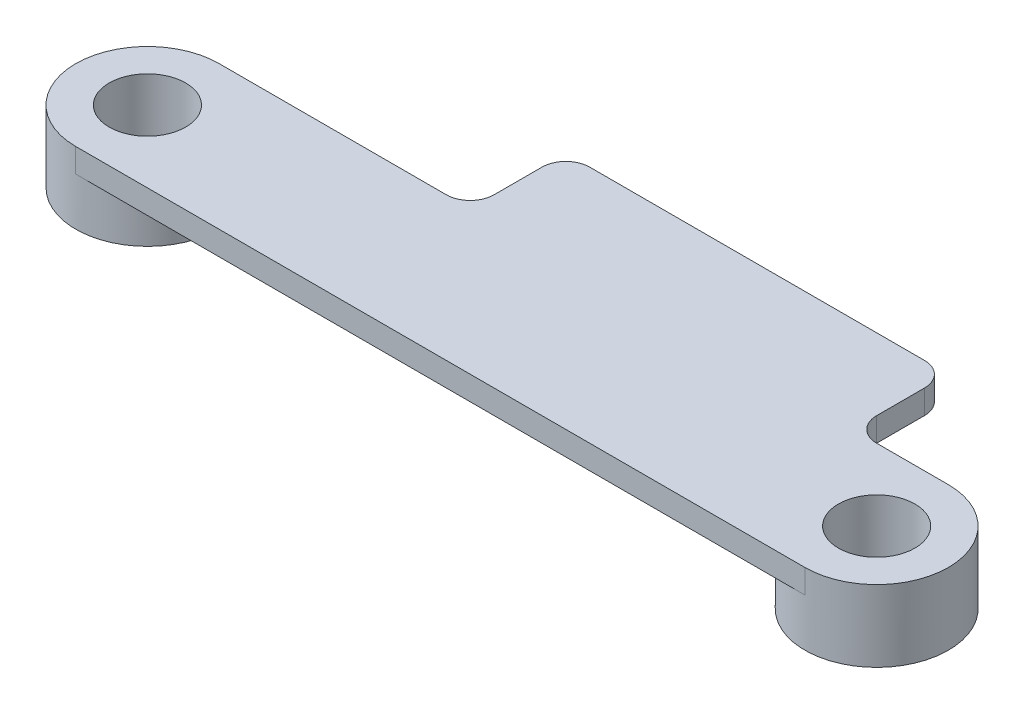
ISO-10303-21;
HEADER;
FILE_DESCRIPTION(('STEP AP214'),'2;1');
FILE_NAME('part.step','',(''),(''),'','','');
FILE_SCHEMA(('AUTOMOTIVE_DESIGN { 1 0 10303 214 1 1 1 1 }'));
ENDSEC;
DATA;
#1=APPLICATION_CONTEXT('core data for automotive mechanical design processes');
#2=APPLICATION_PROTOCOL_DEFINITION('international standard','automotive_design',2000,#1);
#3=PRODUCT_CONTEXT('',#1,'mechanical');
#4=PRODUCT('Part','Part','',(#3));
#5=PRODUCT_RELATED_PRODUCT_CATEGORY('part','',(#4));
#6=PRODUCT_DEFINITION_FORMATION('','',#4);
#7=PRODUCT_DEFINITION_CONTEXT('part definition',#1,'design');
#8=PRODUCT_DEFINITION('design','',#6,#7);
#9=PRODUCT_DEFINITION_SHAPE('','',#8);
#10=(LENGTH_UNIT() NAMED_UNIT(*) SI_UNIT(.MILLI.,.METRE.));
#11=(NAMED_UNIT(*) PLANE_ANGLE_UNIT() SI_UNIT($,.RADIAN.));
#12=(NAMED_UNIT(*) SI_UNIT($,.STERADIAN.) SOLID_ANGLE_UNIT());
#13=UNCERTAINTY_MEASURE_WITH_UNIT(LENGTH_MEASURE(1.E-05),#10,'distance_accuracy_value','');
#14=(GEOMETRIC_REPRESENTATION_CONTEXT(3) GLOBAL_UNCERTAINTY_ASSIGNED_CONTEXT((#13)) GLOBAL_UNIT_ASSIGNED_CONTEXT((#10,
#11,#12)) REPRESENTATION_CONTEXT('',''));
#15=CARTESIAN_POINT('',(0.,0.,0.));
#16=DIRECTION('',(0.,0.,1.));
#17=DIRECTION('',(1.,0.,0.));
#18=AXIS2_PLACEMENT_3D('',#15,#16,#17);
#19=CARTESIAN_POINT('',(0.,0.,0.));
#20=DIRECTION('',(0.,1.,0.));
#21=DIRECTION('',(0.,0.,1.));
#22=AXIS2_PLACEMENT_3D('',#19,#20,#21);
#23=PLANE('',#22);
#24=CARTESIAN_POINT('',(15.25,0.,0.));
#25=DIRECTION('',(0.,-1.,0.));
#26=DIRECTION('',(0.,0.,-1.));
#27=AXIS2_PLACEMENT_3D('',#24,#25,#26);
#28=CIRCLE('',#27,3.);
#29=CARTESIAN_POINT('',(15.25,0.,3.));
#30=VERTEX_POINT('',#29);
#31=CARTESIAN_POINT('',(15.25,0.,-3.));
#32=VERTEX_POINT('',#31);
#33=EDGE_CURVE('E122',#30,#32,#28,.T.);
#34=ORIENTED_EDGE('',*,*,#33,.F.);
#35=DIRECTION('',(1.,0.,0.));
#36=VECTOR('',#35,1.);
#37=CARTESIAN_POINT('',(0.,0.,3.));
#38=LINE('',#37,#36);
#39=CARTESIAN_POINT('',(-15.25,0.,3.));
#40=VERTEX_POINT('',#39);
#41=EDGE_CURVE('E125',#40,#30,#38,.T.);
#42=ORIENTED_EDGE('',*,*,#41,.F.);
#43=CARTESIAN_POINT('',(-15.25,0.,0.));
#44=DIRECTION('',(0.,-1.,0.));
#45=DIRECTION('',(0.,0.,-1.));
#46=AXIS2_PLACEMENT_3D('',#43,#44,#45);
#47=CIRCLE('',#46,3.);
#48=CARTESIAN_POINT('',(-15.25,0.,-3.));
#49=VERTEX_POINT('',#48);
#50=EDGE_CURVE('E155',#49,#40,#47,.T.);
#51=ORIENTED_EDGE('',*,*,#50,.F.);
#52=DIRECTION('',(1.,0.,0.));
#53=VECTOR('',#52,1.);
#54=CARTESIAN_POINT('',(0.,0.,-3.));
#55=LINE('',#54,#53);
#56=CARTESIAN_POINT('',(-5.75000000000001,0.,-3.));
#57=VERTEX_POINT('',#56);
#58=EDGE_CURVE('E169',#49,#57,#55,.T.);
#59=ORIENTED_EDGE('',*,*,#58,.T.);
#60=CARTESIAN_POINT('',(-5.75000000000001,0.,-4.));
#61=DIRECTION('',(0.,1.,0.));
#62=DIRECTION('',(0.,0.,1.));
#63=AXIS2_PLACEMENT_3D('',#60,#61,#62);
#64=CIRCLE('',#63,1.);
#65=CARTESIAN_POINT('',(-4.75000000000001,0.,-4.));
#66=VERTEX_POINT('',#65);
#67=EDGE_CURVE('E41',#57,#66,#64,.T.);
#68=ORIENTED_EDGE('',*,*,#67,.T.);
#69=DIRECTION('',(0.,0.,-1.));
#70=VECTOR('',#69,1.);
#71=CARTESIAN_POINT('',(-4.75000000000001,0.,0.));
#72=LINE('',#71,#70);
#73=CARTESIAN_POINT('',(-4.75000000000001,0.,-6.));
#74=VERTEX_POINT('',#73);
#75=EDGE_CURVE('E166',#66,#74,#72,.T.);
#76=ORIENTED_EDGE('',*,*,#75,.T.);
#77=CARTESIAN_POINT('',(-3.75,0.,-6.));
#78=DIRECTION('',(0.,1.,0.));
#79=DIRECTION('',(0.,0.,1.));
#80=AXIS2_PLACEMENT_3D('',#77,#78,#79);
#81=CIRCLE('',#80,1.);
#82=CARTESIAN_POINT('',(-3.75,0.,-7.));
#83=VERTEX_POINT('',#82);
#84=EDGE_CURVE('E189',#74,#83,#81,.F.);
#85=ORIENTED_EDGE('',*,*,#84,.T.);
#86=DIRECTION('',(1.,0.,0.));
#87=VECTOR('',#86,1.);
#88=CARTESIAN_POINT('',(0.,0.,-7.));
#89=LINE('',#88,#87);
#90=CARTESIAN_POINT('',(10.25,0.,-7.));
#91=VERTEX_POINT('',#90);
#92=EDGE_CURVE('E163',#83,#91,#89,.T.);
#93=ORIENTED_EDGE('',*,*,#92,.T.);
#94=CARTESIAN_POINT('',(10.25,0.,-6.));
#95=DIRECTION('',(0.,1.,0.));
#96=DIRECTION('',(0.,0.,1.));
#97=AXIS2_PLACEMENT_3D('',#94,#95,#96);
#98=CIRCLE('',#97,1.);
#99=CARTESIAN_POINT('',(11.25,0.,-6.));
#100=VERTEX_POINT('',#99);
#101=EDGE_CURVE('E191',#91,#100,#98,.F.);
#102=ORIENTED_EDGE('',*,*,#101,.T.);
#103=DIRECTION('',(0.,0.,-1.));
#104=VECTOR('',#103,1.);
#105=CARTESIAN_POINT('',(11.25,0.,0.));
#106=LINE('',#105,#104);
#107=CARTESIAN_POINT('',(11.25,0.,-4.));
#108=VERTEX_POINT('',#107);
#109=EDGE_CURVE('E152',#108,#100,#106,.T.);
#110=ORIENTED_EDGE('',*,*,#109,.F.);
#111=CARTESIAN_POINT('',(12.25,0.,-4.));
#112=DIRECTION('',(0.,1.,0.));
#113=DIRECTION('',(0.,0.,1.));
#114=AXIS2_PLACEMENT_3D('',#111,#112,#113);
#115=CIRCLE('',#114,1.);
#116=CARTESIAN_POINT('',(12.25,0.,-3.));
#117=VERTEX_POINT('',#116);
#118=EDGE_CURVE('E204',#108,#117,#115,.T.);
#119=ORIENTED_EDGE('',*,*,#118,.T.);
#120=DIRECTION('',(1.,0.,0.));
#121=VECTOR('',#120,1.);
#122=CARTESIAN_POINT('',(0.,0.,-3.));
#123=LINE('',#122,#121);
#124=EDGE_CURVE('E127',#117,#32,#123,.T.);
#125=ORIENTED_EDGE('',*,*,#124,.T.);
#126=EDGE_LOOP('',(#34,#42,#51,#59,#68,#76,#85,#93,#102,#110,#119,#125));
#127=FACE_BOUND('',#126,.T.);
#128=ADVANCED_FACE('F33',(#127),#23,.F.);
#129=CARTESIAN_POINT('',(0.,1.,3.));
#130=DIRECTION('',(0.,0.,-1.));
#131=DIRECTION('',(-1.,0.,0.));
#132=AXIS2_PLACEMENT_3D('',#129,#130,#131);
#133=PLANE('',#132);
#134=ORIENTED_EDGE('',*,*,#41,.T.);
#135=DIRECTION('',(0.,-1.,0.));
#136=VECTOR('',#135,1.);
#137=CARTESIAN_POINT('',(15.25,1.,3.));
#138=LINE('',#137,#136);
#139=CARTESIAN_POINT('',(15.25,1.,3.));
#140=VERTEX_POINT('',#139);
#141=EDGE_CURVE('E135',#140,#30,#138,.T.);
#142=ORIENTED_EDGE('',*,*,#141,.F.);
#143=DIRECTION('',(1.,0.,0.));
#144=VECTOR('',#143,1.);
#145=CARTESIAN_POINT('',(0.,1.,3.));
#146=LINE('',#145,#144);
#147=CARTESIAN_POINT('',(-15.25,1.,3.));
#148=VERTEX_POINT('',#147);
#149=EDGE_CURVE('E172',#148,#140,#146,.T.);
#150=ORIENTED_EDGE('',*,*,#149,.F.);
#151=DIRECTION('',(0.,-1.,0.));
#152=VECTOR('',#151,1.);
#153=CARTESIAN_POINT('',(-15.25,1.,3.));
#154=LINE('',#153,#152);
#155=EDGE_CURVE('E149',#148,#40,#154,.T.);
#156=ORIENTED_EDGE('',*,*,#155,.T.);
#157=EDGE_LOOP('',(#134,#142,#150,#156));
#158=FACE_BOUND('',#157,.T.);
#159=ADVANCED_FACE('F147',(#158),#133,.F.);
#160=CARTESIAN_POINT('',(15.25,1.,0.));
#161=DIRECTION('',(0.,-1.,0.));
#162=DIRECTION('',(0.,0.,-1.));
#163=AXIS2_PLACEMENT_3D('',#160,#161,#162);
#164=CYLINDRICAL_SURFACE('',#163,3.);
#165=ORIENTED_EDGE('',*,*,#141,.T.);
#166=ORIENTED_EDGE('',*,*,#33,.T.);
#167=DIRECTION('',(0.,-1.,0.));
#168=VECTOR('',#167,1.);
#169=CARTESIAN_POINT('',(15.25,1.,-3.));
#170=LINE('',#169,#168);
#171=CARTESIAN_POINT('',(15.25,1.,-3.));
#172=VERTEX_POINT('',#171);
#173=EDGE_CURVE('E144',#172,#32,#170,.T.);
#174=ORIENTED_EDGE('',*,*,#173,.F.);
#175=CARTESIAN_POINT('',(15.25,1.,0.));
#176=DIRECTION('',(0.,1.,0.));
#177=DIRECTION('',(0.,0.,1.));
#178=AXIS2_PLACEMENT_3D('',#175,#176,#177);
#179=CIRCLE('',#178,3.);
#180=EDGE_CURVE('E139',#140,#172,#179,.T.);
#181=ORIENTED_EDGE('',*,*,#180,.F.);
#182=EDGE_LOOP('',(#165,#166,#174,#181));
#183=FACE_BOUND('',#182,.T.);
#184=CARTESIAN_POINT('',(15.25,-2.,0.));
#185=DIRECTION('',(0.,-1.,0.));
#186=DIRECTION('',(0.,0.,-1.));
#187=AXIS2_PLACEMENT_3D('',#184,#185,#186);
#188=CIRCLE('',#187,3.);
#189=CARTESIAN_POINT('',(15.25,-2.,-3.));
#190=VERTEX_POINT('',#189);
#191=EDGE_CURVE('E131',#190,#190,#188,.T.);
#192=ORIENTED_EDGE('',*,*,#191,.F.);
#193=EDGE_LOOP('',(#192));
#194=FACE_BOUND('',#193,.T.);
#195=ADVANCED_FACE('F136',(#183,#194),#164,.T.);
#196=CARTESIAN_POINT('',(0.,1.,-3.));
#197=DIRECTION('',(0.,0.,-1.));
#198=DIRECTION('',(-1.,0.,0.));
#199=AXIS2_PLACEMENT_3D('',#196,#197,#198);
#200=PLANE('',#199);
#201=ORIENTED_EDGE('',*,*,#124,.F.);
#202=DIRECTION('',(0.,-1.,0.));
#203=VECTOR('',#202,1.);
#204=CARTESIAN_POINT('',(12.25,1.,-3.));
#205=LINE('',#204,#203);
#206=CARTESIAN_POINT('',(12.25,1.,-3.));
#207=VERTEX_POINT('',#206);
#208=EDGE_CURVE('E182',#117,#207,#205,.F.);
#209=ORIENTED_EDGE('',*,*,#208,.T.);
#210=DIRECTION('',(1.,0.,0.));
#211=VECTOR('',#210,1.);
#212=CARTESIAN_POINT('',(0.,1.,-3.));
#213=LINE('',#212,#211);
#214=EDGE_CURVE('E305',#207,#172,#213,.T.);
#215=ORIENTED_EDGE('',*,*,#214,.T.);
#216=ORIENTED_EDGE('',*,*,#173,.T.);
#217=EDGE_LOOP('',(#201,#209,#215,#216));
#218=FACE_BOUND('',#217,.T.);
#219=ADVANCED_FACE('F276',(#218),#200,.T.);
#220=CARTESIAN_POINT('',(11.25,1.,0.));
#221=DIRECTION('',(-1.,0.,0.));
#222=DIRECTION('',(0.,0.,1.));
#223=AXIS2_PLACEMENT_3D('',#220,#221,#222);
#224=PLANE('',#223);
#225=DIRECTION('',(0.,0.,-1.));
#226=VECTOR('',#225,1.);
#227=CARTESIAN_POINT('',(11.25,1.,0.));
#228=LINE('',#227,#226);
#229=CARTESIAN_POINT('',(11.25,1.,-4.));
#230=VERTEX_POINT('',#229);
#231=CARTESIAN_POINT('',(11.25,1.,-6.));
#232=VERTEX_POINT('',#231);
#233=EDGE_CURVE('E301',#230,#232,#228,.T.);
#234=ORIENTED_EDGE('',*,*,#233,.F.);
#235=DIRECTION('',(0.,-1.,0.));
#236=VECTOR('',#235,1.);
#237=CARTESIAN_POINT('',(11.25,1.,-4.));
#238=LINE('',#237,#236);
#239=EDGE_CURVE('E179',#230,#108,#238,.T.);
#240=ORIENTED_EDGE('',*,*,#239,.T.);
#241=ORIENTED_EDGE('',*,*,#109,.T.);
#242=DIRECTION('',(0.,-1.,0.));
#243=VECTOR('',#242,1.);
#244=CARTESIAN_POINT('',(11.25,1.,-6.));
#245=LINE('',#244,#243);
#246=EDGE_CURVE('E143',#100,#232,#245,.F.);
#247=ORIENTED_EDGE('',*,*,#246,.T.);
#248=EDGE_LOOP('',(#234,#240,#241,#247));
#249=FACE_BOUND('',#248,.T.);
#250=ADVANCED_FACE('F272',(#249),#224,.F.);
#251=CARTESIAN_POINT('',(0.,1.,-7.));
#252=DIRECTION('',(0.,0.,-1.));
#253=DIRECTION('',(-1.,0.,0.));
#254=AXIS2_PLACEMENT_3D('',#251,#252,#253);
#255=PLANE('',#254);
#256=DIRECTION('',(1.,0.,0.));
#257=VECTOR('',#256,1.);
#258=CARTESIAN_POINT('',(0.,1.,-7.));
#259=LINE('',#258,#257);
#260=CARTESIAN_POINT('',(-3.75,1.,-7.));
#261=VERTEX_POINT('',#260);
#262=CARTESIAN_POINT('',(10.25,1.,-7.));
#263=VERTEX_POINT('',#262);
#264=EDGE_CURVE('E224',#261,#263,#259,.T.);
#265=ORIENTED_EDGE('',*,*,#264,.T.);
#266=DIRECTION('',(0.,-1.,0.));
#267=VECTOR('',#266,1.);
#268=CARTESIAN_POINT('',(10.25,0.,-7.));
#269=LINE('',#268,#267);
#270=EDGE_CURVE('E186',#263,#91,#269,.T.);
#271=ORIENTED_EDGE('',*,*,#270,.T.);
#272=ORIENTED_EDGE('',*,*,#92,.F.);
#273=DIRECTION('',(0.,-1.,0.));
#274=VECTOR('',#273,1.);
#275=CARTESIAN_POINT('',(-3.75,1.,-7.));
#276=LINE('',#275,#274);
#277=EDGE_CURVE('E184',#83,#261,#276,.F.);
#278=ORIENTED_EDGE('',*,*,#277,.T.);
#279=EDGE_LOOP('',(#265,#271,#272,#278));
#280=FACE_BOUND('',#279,.T.);
#281=ADVANCED_FACE('F269',(#280),#255,.T.);
#282=CARTESIAN_POINT('',(-4.75000000000001,1.,0.));
#283=DIRECTION('',(-1.,0.,0.));
#284=DIRECTION('',(0.,0.,1.));
#285=AXIS2_PLACEMENT_3D('',#282,#283,#284);
#286=PLANE('',#285);
#287=DIRECTION('',(0.,0.,-1.));
#288=VECTOR('',#287,1.);
#289=CARTESIAN_POINT('',(-4.75000000000001,1.,0.));
#290=LINE('',#289,#288);
#291=CARTESIAN_POINT('',(-4.75000000000001,1.,-4.));
#292=VERTEX_POINT('',#291);
#293=CARTESIAN_POINT('',(-4.75000000000001,1.,-6.));
#294=VERTEX_POINT('',#293);
#295=EDGE_CURVE('E220',#292,#294,#290,.T.);
#296=ORIENTED_EDGE('',*,*,#295,.T.);
#297=DIRECTION('',(0.,-1.,0.));
#298=VECTOR('',#297,1.);
#299=CARTESIAN_POINT('',(-4.75000000000001,1.,-6.));
#300=LINE('',#299,#298);
#301=EDGE_CURVE('E198',#294,#74,#300,.T.);
#302=ORIENTED_EDGE('',*,*,#301,.T.);
#303=ORIENTED_EDGE('',*,*,#75,.F.);
#304=DIRECTION('',(0.,-1.,0.));
#305=VECTOR('',#304,1.);
#306=CARTESIAN_POINT('',(-4.75000000000001,1.,-4.));
#307=LINE('',#306,#305);
#308=EDGE_CURVE('E196',#66,#292,#307,.F.);
#309=ORIENTED_EDGE('',*,*,#308,.T.);
#310=EDGE_LOOP('',(#296,#302,#303,#309));
#311=FACE_BOUND('',#310,.T.);
#312=ADVANCED_FACE('F213',(#311),#286,.T.);
#313=CARTESIAN_POINT('',(0.,1.,-3.));
#314=DIRECTION('',(0.,0.,-1.));
#315=DIRECTION('',(-1.,0.,0.));
#316=AXIS2_PLACEMENT_3D('',#313,#314,#315);
#317=PLANE('',#316);
#318=DIRECTION('',(1.,0.,0.));
#319=VECTOR('',#318,1.);
#320=CARTESIAN_POINT('',(0.,1.,-3.));
#321=LINE('',#320,#319);
#322=CARTESIAN_POINT('',(-15.25,1.,-3.));
#323=VERTEX_POINT('',#322);
#324=CARTESIAN_POINT('',(-5.75000000000001,1.,-3.));
#325=VERTEX_POINT('',#324);
#326=EDGE_CURVE('E217',#323,#325,#321,.T.);
#327=ORIENTED_EDGE('',*,*,#326,.T.);
#328=DIRECTION('',(0.,-1.,0.));
#329=VECTOR('',#328,1.);
#330=CARTESIAN_POINT('',(-5.75000000000001,0.,-3.));
#331=LINE('',#330,#329);
#332=EDGE_CURVE('E201',#325,#57,#331,.T.);
#333=ORIENTED_EDGE('',*,*,#332,.T.);
#334=ORIENTED_EDGE('',*,*,#58,.F.);
#335=DIRECTION('',(0.,-1.,0.));
#336=VECTOR('',#335,1.);
#337=CARTESIAN_POINT('',(-15.25,1.,-3.));
#338=LINE('',#337,#336);
#339=EDGE_CURVE('E174',#323,#49,#338,.T.);
#340=ORIENTED_EDGE('',*,*,#339,.F.);
#341=EDGE_LOOP('',(#327,#333,#334,#340));
#342=FACE_BOUND('',#341,.T.);
#343=ADVANCED_FACE('F216',(#342),#317,.T.);
#344=CARTESIAN_POINT('',(-15.25,1.,0.));
#345=DIRECTION('',(0.,-1.,0.));
#346=DIRECTION('',(0.,0.,-1.));
#347=AXIS2_PLACEMENT_3D('',#344,#345,#346);
#348=CYLINDRICAL_SURFACE('',#347,1.6);
#349=CARTESIAN_POINT('',(-15.25,1.,0.));
#350=DIRECTION('',(0.,1.,0.));
#351=DIRECTION('',(0.,0.,1.));
#352=AXIS2_PLACEMENT_3D('',#349,#350,#351);
#353=CIRCLE('',#352,1.6);
#354=CARTESIAN_POINT('',(-15.25,1.,1.6));
#355=VERTEX_POINT('',#354);
#356=EDGE_CURVE('E222',#355,#355,#353,.T.);
#357=ORIENTED_EDGE('',*,*,#356,.T.);
#358=EDGE_LOOP('',(#357));
#359=FACE_BOUND('',#358,.T.);
#360=CARTESIAN_POINT('',(-15.25,-2.,0.));
#361=DIRECTION('',(0.,-1.,0.));
#362=DIRECTION('',(0.,0.,-1.));
#363=AXIS2_PLACEMENT_3D('',#360,#361,#362);
#364=CIRCLE('',#363,1.6);
#365=CARTESIAN_POINT('',(-15.25,-2.,-1.6));
#366=VERTEX_POINT('',#365);
#367=EDGE_CURVE('E311',#366,#366,#364,.T.);
#368=ORIENTED_EDGE('',*,*,#367,.T.);
#369=EDGE_LOOP('',(#368));
#370=FACE_BOUND('',#369,.T.);
#371=ADVANCED_FACE('F259',(#359,#370),#348,.F.);
#372=CARTESIAN_POINT('',(-15.25,1.,0.));
#373=DIRECTION('',(0.,-1.,0.));
#374=DIRECTION('',(0.,0.,-1.));
#375=AXIS2_PLACEMENT_3D('',#372,#373,#374);
#376=CYLINDRICAL_SURFACE('',#375,3.);
#377=ORIENTED_EDGE('',*,*,#339,.T.);
#378=ORIENTED_EDGE('',*,*,#50,.T.);
#379=ORIENTED_EDGE('',*,*,#155,.F.);
#380=CARTESIAN_POINT('',(-15.25,1.,0.));
#381=DIRECTION('',(0.,1.,0.));
#382=DIRECTION('',(0.,0.,1.));
#383=AXIS2_PLACEMENT_3D('',#380,#381,#382);
#384=CIRCLE('',#383,3.);
#385=EDGE_CURVE('E219',#323,#148,#384,.T.);
#386=ORIENTED_EDGE('',*,*,#385,.F.);
#387=EDGE_LOOP('',(#377,#378,#379,#386));
#388=FACE_BOUND('',#387,.T.);
#389=CARTESIAN_POINT('',(-15.25,-2.,0.));
#390=DIRECTION('',(0.,-1.,0.));
#391=DIRECTION('',(0.,0.,-1.));
#392=AXIS2_PLACEMENT_3D('',#389,#390,#391);
#393=CIRCLE('',#392,3.);
#394=CARTESIAN_POINT('',(-15.25,-2.,-3.));
#395=VERTEX_POINT('',#394);
#396=EDGE_CURVE('E150',#395,#395,#393,.T.);
#397=ORIENTED_EDGE('',*,*,#396,.F.);
#398=EDGE_LOOP('',(#397));
#399=FACE_BOUND('',#398,.T.);
#400=ADVANCED_FACE('F247',(#388,#399),#376,.T.);
#401=CARTESIAN_POINT('',(15.25,1.,0.));
#402=DIRECTION('',(0.,-1.,0.));
#403=DIRECTION('',(0.,0.,-1.));
#404=AXIS2_PLACEMENT_3D('',#401,#402,#403);
#405=CYLINDRICAL_SURFACE('',#404,1.6);
#406=CARTESIAN_POINT('',(15.25,1.,0.));
#407=DIRECTION('',(0.,1.,0.));
#408=DIRECTION('',(0.,0.,1.));
#409=AXIS2_PLACEMENT_3D('',#406,#407,#408);
#410=CIRCLE('',#409,1.6);
#411=CARTESIAN_POINT('',(15.25,1.,1.6));
#412=VERTEX_POINT('',#411);
#413=EDGE_CURVE('E158',#412,#412,#410,.T.);
#414=ORIENTED_EDGE('',*,*,#413,.T.);
#415=EDGE_LOOP('',(#414));
#416=FACE_BOUND('',#415,.T.);
#417=CARTESIAN_POINT('',(15.25,-2.,0.));
#418=DIRECTION('',(0.,-1.,0.));
#419=DIRECTION('',(0.,0.,-1.));
#420=AXIS2_PLACEMENT_3D('',#417,#418,#419);
#421=CIRCLE('',#420,1.6);
#422=CARTESIAN_POINT('',(15.25,-2.,-1.6));
#423=VERTEX_POINT('',#422);
#424=EDGE_CURVE('E132',#423,#423,#421,.T.);
#425=ORIENTED_EDGE('',*,*,#424,.T.);
#426=EDGE_LOOP('',(#425));
#427=FACE_BOUND('',#426,.T.);
#428=ADVANCED_FACE('F233',(#416,#427),#405,.F.);
#429=CARTESIAN_POINT('',(0.,1.,0.));
#430=DIRECTION('',(0.,1.,0.));
#431=DIRECTION('',(0.,0.,1.));
#432=AXIS2_PLACEMENT_3D('',#429,#430,#431);
#433=PLANE('',#432);
#434=ORIENTED_EDGE('',*,*,#233,.T.);
#435=CARTESIAN_POINT('',(10.25,1.,-6.));
#436=DIRECTION('',(0.,1.,0.));
#437=DIRECTION('',(0.,0.,1.));
#438=AXIS2_PLACEMENT_3D('',#435,#436,#437);
#439=CIRCLE('',#438,1.);
#440=EDGE_CURVE('E194',#232,#263,#439,.T.);
#441=ORIENTED_EDGE('',*,*,#440,.T.);
#442=ORIENTED_EDGE('',*,*,#264,.F.);
#443=CARTESIAN_POINT('',(-3.75,1.,-6.));
#444=DIRECTION('',(0.,1.,0.));
#445=DIRECTION('',(0.,0.,1.));
#446=AXIS2_PLACEMENT_3D('',#443,#444,#445);
#447=CIRCLE('',#446,1.);
#448=EDGE_CURVE('E52',#261,#294,#447,.T.);
#449=ORIENTED_EDGE('',*,*,#448,.T.);
#450=ORIENTED_EDGE('',*,*,#295,.F.);
#451=CARTESIAN_POINT('',(-5.75000000000001,1.,-4.));
#452=DIRECTION('',(0.,1.,0.));
#453=DIRECTION('',(0.,0.,1.));
#454=AXIS2_PLACEMENT_3D('',#451,#452,#453);
#455=CIRCLE('',#454,1.);
#456=EDGE_CURVE('E11',#292,#325,#455,.F.);
#457=ORIENTED_EDGE('',*,*,#456,.T.);
#458=ORIENTED_EDGE('',*,*,#326,.F.);
#459=ORIENTED_EDGE('',*,*,#385,.T.);
#460=ORIENTED_EDGE('',*,*,#149,.T.);
#461=ORIENTED_EDGE('',*,*,#180,.T.);
#462=ORIENTED_EDGE('',*,*,#214,.F.);
#463=CARTESIAN_POINT('',(12.25,1.,-4.));
#464=DIRECTION('',(0.,1.,0.));
#465=DIRECTION('',(0.,0.,1.));
#466=AXIS2_PLACEMENT_3D('',#463,#464,#465);
#467=CIRCLE('',#466,1.);
#468=EDGE_CURVE('E206',#207,#230,#467,.F.);
#469=ORIENTED_EDGE('',*,*,#468,.T.);
#470=EDGE_LOOP('',(#434,#441,#442,#449,#450,#457,#458,#459,#460,#461,#462,#469));
#471=FACE_BOUND('',#470,.T.);
#472=ORIENTED_EDGE('',*,*,#356,.F.);
#473=EDGE_LOOP('',(#472));
#474=FACE_BOUND('',#473,.T.);
#475=ORIENTED_EDGE('',*,*,#413,.F.);
#476=EDGE_LOOP('',(#475));
#477=FACE_BOUND('',#476,.T.);
#478=ADVANCED_FACE('F236',(#471,#474,#477),#433,.T.);
#479=CARTESIAN_POINT('',(12.25,1.,-4.));
#480=DIRECTION('',(0.,-1.,0.));
#481=DIRECTION('',(0.,0.,-1.));
#482=AXIS2_PLACEMENT_3D('',#479,#480,#481);
#483=CYLINDRICAL_SURFACE('',#482,1.);
#484=ORIENTED_EDGE('',*,*,#468,.F.);
#485=ORIENTED_EDGE('',*,*,#208,.F.);
#486=ORIENTED_EDGE('',*,*,#118,.F.);
#487=ORIENTED_EDGE('',*,*,#239,.F.);
#488=EDGE_LOOP('',(#484,#485,#486,#487));
#489=FACE_BOUND('',#488,.T.);
#490=ADVANCED_FACE('F238',(#489),#483,.F.);
#491=CARTESIAN_POINT('',(10.25,1.,-6.));
#492=DIRECTION('',(0.,1.,0.));
#493=DIRECTION('',(0.,0.,1.));
#494=AXIS2_PLACEMENT_3D('',#491,#492,#493);
#495=CYLINDRICAL_SURFACE('',#494,1.);
#496=ORIENTED_EDGE('',*,*,#440,.F.);
#497=ORIENTED_EDGE('',*,*,#246,.F.);
#498=ORIENTED_EDGE('',*,*,#101,.F.);
#499=ORIENTED_EDGE('',*,*,#270,.F.);
#500=EDGE_LOOP('',(#496,#497,#498,#499));
#501=FACE_BOUND('',#500,.T.);
#502=ADVANCED_FACE('F244',(#501),#495,.T.);
#503=CARTESIAN_POINT('',(-3.75,1.,-6.));
#504=DIRECTION('',(0.,-1.,0.));
#505=DIRECTION('',(0.,0.,-1.));
#506=AXIS2_PLACEMENT_3D('',#503,#504,#505);
#507=CYLINDRICAL_SURFACE('',#506,1.);
#508=ORIENTED_EDGE('',*,*,#448,.F.);
#509=ORIENTED_EDGE('',*,*,#277,.F.);
#510=ORIENTED_EDGE('',*,*,#84,.F.);
#511=ORIENTED_EDGE('',*,*,#301,.F.);
#512=EDGE_LOOP('',(#508,#509,#510,#511));
#513=FACE_BOUND('',#512,.T.);
#514=ADVANCED_FACE('F284',(#513),#507,.T.);
#515=CARTESIAN_POINT('',(-5.75000000000001,1.,-4.));
#516=DIRECTION('',(0.,1.,0.));
#517=DIRECTION('',(0.,0.,1.));
#518=AXIS2_PLACEMENT_3D('',#515,#516,#517);
#519=CYLINDRICAL_SURFACE('',#518,1.);
#520=ORIENTED_EDGE('',*,*,#456,.F.);
#521=ORIENTED_EDGE('',*,*,#308,.F.);
#522=ORIENTED_EDGE('',*,*,#67,.F.);
#523=ORIENTED_EDGE('',*,*,#332,.F.);
#524=EDGE_LOOP('',(#520,#521,#522,#523));
#525=FACE_BOUND('',#524,.T.);
#526=ADVANCED_FACE('F35',(#525),#519,.F.);
#527=CARTESIAN_POINT('',(-15.25,-2.,0.));
#528=DIRECTION('',(0.,-1.,0.));
#529=DIRECTION('',(0.,0.,-1.));
#530=AXIS2_PLACEMENT_3D('',#527,#528,#529);
#531=PLANE('',#530);
#532=ORIENTED_EDGE('',*,*,#396,.T.);
#533=EDGE_LOOP('',(#532));
#534=FACE_BOUND('',#533,.T.);
#535=ORIENTED_EDGE('',*,*,#367,.F.);
#536=EDGE_LOOP('',(#535));
#537=FACE_BOUND('',#536,.T.);
#538=ADVANCED_FACE('F291',(#534,#537),#531,.T.);
#539=CARTESIAN_POINT('',(15.25,-2.,0.));
#540=DIRECTION('',(0.,-1.,0.));
#541=DIRECTION('',(0.,0.,-1.));
#542=AXIS2_PLACEMENT_3D('',#539,#540,#541);
#543=PLANE('',#542);
#544=ORIENTED_EDGE('',*,*,#191,.T.);
#545=EDGE_LOOP('',(#544));
#546=FACE_BOUND('',#545,.T.);
#547=ORIENTED_EDGE('',*,*,#424,.F.);
#548=EDGE_LOOP('',(#547));
#549=FACE_BOUND('',#548,.T.);
#550=ADVANCED_FACE('F320',(#546,#549),#543,.T.);
#551=CLOSED_SHELL('',(#128,#159,#195,#219,#250,#281,#312,#343,#371,#400,#428,#478,#490,#502,
#514,#526,#538,#550));
#552=MANIFOLD_SOLID_BREP('B2',#551);
#553=ADVANCED_BREP_SHAPE_REPRESENTATION('',(#18,#552),#14);
#554=SHAPE_DEFINITION_REPRESENTATION(#9,#553);
ENDSEC;
END-ISO-10303-21;
